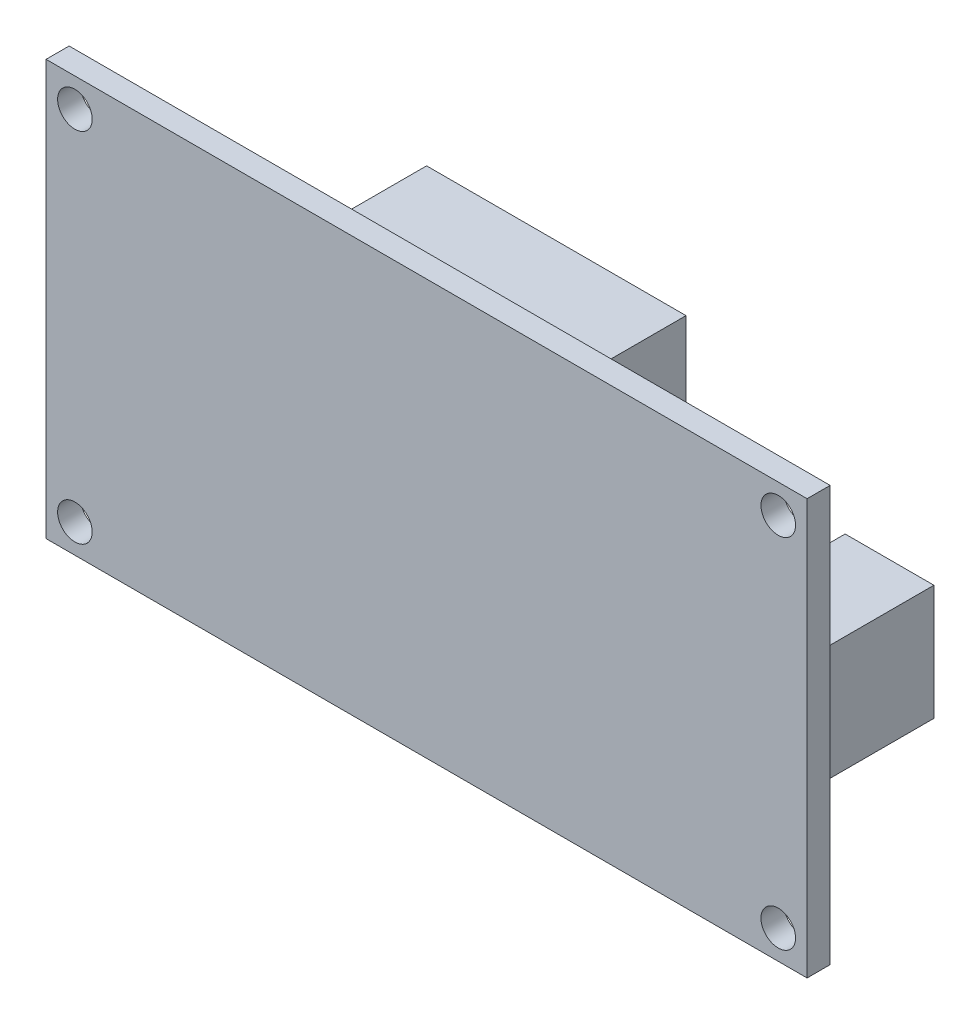
ISO-10303-21;
HEADER;
FILE_DESCRIPTION(('STEP AP214'),'2;1');
FILE_NAME('part.step','',(''),(''),'','','');
FILE_SCHEMA(('AUTOMOTIVE_DESIGN { 1 0 10303 214 1 1 1 1 }'));
ENDSEC;
DATA;
#1=APPLICATION_CONTEXT('core data for automotive mechanical design processes');
#2=APPLICATION_PROTOCOL_DEFINITION('international standard','automotive_design',2000,#1);
#3=PRODUCT_CONTEXT('',#1,'mechanical');
#4=PRODUCT('Part','Part','',(#3));
#5=PRODUCT_RELATED_PRODUCT_CATEGORY('part','',(#4));
#6=PRODUCT_DEFINITION_FORMATION('','',#4);
#7=PRODUCT_DEFINITION_CONTEXT('part definition',#1,'design');
#8=PRODUCT_DEFINITION('design','',#6,#7);
#9=PRODUCT_DEFINITION_SHAPE('','',#8);
#10=(LENGTH_UNIT() NAMED_UNIT(*) SI_UNIT(.MILLI.,.METRE.));
#11=(NAMED_UNIT(*) PLANE_ANGLE_UNIT() SI_UNIT($,.RADIAN.));
#12=(NAMED_UNIT(*) SI_UNIT($,.STERADIAN.) SOLID_ANGLE_UNIT());
#13=UNCERTAINTY_MEASURE_WITH_UNIT(LENGTH_MEASURE(1.E-05),#10,'distance_accuracy_value','');
#14=(GEOMETRIC_REPRESENTATION_CONTEXT(3) GLOBAL_UNCERTAINTY_ASSIGNED_CONTEXT((#13)) GLOBAL_UNIT_ASSIGNED_CONTEXT((#10,
#11,#12)) REPRESENTATION_CONTEXT('',''));
#15=CARTESIAN_POINT('',(0.,0.,0.));
#16=DIRECTION('',(0.,0.,1.));
#17=DIRECTION('',(1.,0.,0.));
#18=AXIS2_PLACEMENT_3D('',#15,#16,#17);
#19=CARTESIAN_POINT('',(0.,0.,0.));
#20=DIRECTION('',(0.,0.,1.));
#21=DIRECTION('',(1.,0.,0.));
#22=AXIS2_PLACEMENT_3D('',#19,#20,#21);
#23=PLANE('',#22);
#24=CARTESIAN_POINT('',(13.,10.,0.));
#25=DIRECTION('',(0.,0.,1.));
#26=DIRECTION('',(1.,0.,0.));
#27=AXIS2_PLACEMENT_3D('',#24,#25,#26);
#28=CIRCLE('',#27,4.);
#29=CARTESIAN_POINT('',(17.,10.,0.));
#30=VERTEX_POINT('',#29);
#31=EDGE_CURVE('E644',#30,#30,#28,.T.);
#32=ORIENTED_EDGE('',*,*,#31,.T.);
#33=EDGE_LOOP('',(#32));
#34=FACE_BOUND('',#33,.T.);
#35=CARTESIAN_POINT('',(50.,10.,0.));
#36=DIRECTION('',(0.,0.,1.));
#37=DIRECTION('',(1.,0.,0.));
#38=AXIS2_PLACEMENT_3D('',#35,#36,#37);
#39=CIRCLE('',#38,4.);
#40=CARTESIAN_POINT('',(54.,10.,0.));
#41=VERTEX_POINT('',#40);
#42=EDGE_CURVE('E180',#41,#41,#39,.T.);
#43=ORIENTED_EDGE('',*,*,#42,.T.);
#44=EDGE_LOOP('',(#43));
#45=FACE_BOUND('',#44,.T.);
#46=DIRECTION('',(0.,1.,0.));
#47=VECTOR('',#46,1.);
#48=CARTESIAN_POINT('',(23.5,0.,0.));
#49=LINE('',#48,#47);
#50=CARTESIAN_POINT('',(23.5,21.,0.));
#51=VERTEX_POINT('',#50);
#52=CARTESIAN_POINT('',(23.5,35.,0.));
#53=VERTEX_POINT('',#52);
#54=EDGE_CURVE('E176',#51,#53,#49,.T.);
#55=ORIENTED_EDGE('',*,*,#54,.F.);
#56=DIRECTION('',(1.,0.,0.));
#57=VECTOR('',#56,1.);
#58=CARTESIAN_POINT('',(0.,21.,0.));
#59=LINE('',#58,#57);
#60=CARTESIAN_POINT('',(46.,21.,0.));
#61=VERTEX_POINT('',#60);
#62=EDGE_CURVE('E185',#51,#61,#59,.T.);
#63=ORIENTED_EDGE('',*,*,#62,.T.);
#64=DIRECTION('',(0.,1.,0.));
#65=VECTOR('',#64,1.);
#66=CARTESIAN_POINT('',(46.,0.,0.));
#67=LINE('',#66,#65);
#68=CARTESIAN_POINT('',(46.,35.,0.));
#69=VERTEX_POINT('',#68);
#70=EDGE_CURVE('E158',#61,#69,#67,.T.);
#71=ORIENTED_EDGE('',*,*,#70,.T.);
#72=DIRECTION('',(1.,0.,0.));
#73=VECTOR('',#72,1.);
#74=CARTESIAN_POINT('',(0.,35.,0.));
#75=LINE('',#74,#73);
#76=EDGE_CURVE('E53',#53,#69,#75,.T.);
#77=ORIENTED_EDGE('',*,*,#76,.F.);
#78=EDGE_LOOP('',(#55,#63,#71,#77));
#79=FACE_BOUND('',#78,.T.);
#80=DIRECTION('',(1.,0.,0.));
#81=VECTOR('',#80,1.);
#82=CARTESIAN_POINT('',(0.,13.,0.));
#83=LINE('',#82,#81);
#84=CARTESIAN_POINT('',(57.3,13.,0.));
#85=VERTEX_POINT('',#84);
#86=CARTESIAN_POINT('',(65.,13.,0.));
#87=VERTEX_POINT('',#86);
#88=EDGE_CURVE('E199',#85,#87,#83,.T.);
#89=ORIENTED_EDGE('',*,*,#88,.T.);
#90=DIRECTION('',(0.,1.,0.));
#91=VECTOR('',#90,1.);
#92=CARTESIAN_POINT('',(65.,0.,0.));
#93=LINE('',#92,#91);
#94=CARTESIAN_POINT('',(65.,23.,0.));
#95=VERTEX_POINT('',#94);
#96=EDGE_CURVE('E191',#87,#95,#93,.T.);
#97=ORIENTED_EDGE('',*,*,#96,.T.);
#98=DIRECTION('',(-1.,0.,0.));
#99=VECTOR('',#98,1.);
#100=CARTESIAN_POINT('',(0.,23.,0.));
#101=LINE('',#100,#99);
#102=CARTESIAN_POINT('',(57.3,23.,0.));
#103=VERTEX_POINT('',#102);
#104=EDGE_CURVE('E211',#95,#103,#101,.T.);
#105=ORIENTED_EDGE('',*,*,#104,.T.);
#106=DIRECTION('',(0.,-1.,0.));
#107=VECTOR('',#106,1.);
#108=CARTESIAN_POINT('',(57.3,0.,0.));
#109=LINE('',#108,#107);
#110=EDGE_CURVE('E61',#103,#85,#109,.T.);
#111=ORIENTED_EDGE('',*,*,#110,.T.);
#112=EDGE_LOOP('',(#89,#97,#105,#111));
#113=FACE_BOUND('',#112,.T.);
#114=CARTESIAN_POINT('',(63.5,2.5,0.));
#115=DIRECTION('',(0.,0.,1.));
#116=DIRECTION('',(1.,0.,0.));
#117=AXIS2_PLACEMENT_3D('',#114,#115,#116);
#118=CIRCLE('',#117,1.5);
#119=CARTESIAN_POINT('',(65.,2.5,0.));
#120=VERTEX_POINT('',#119);
#121=EDGE_CURVE('E262',#120,#120,#118,.F.);
#122=ORIENTED_EDGE('',*,*,#121,.F.);
#123=EDGE_LOOP('',(#122));
#124=FACE_BOUND('',#123,.T.);
#125=CARTESIAN_POINT('',(2.5,2.5,0.));
#126=DIRECTION('',(0.,0.,1.));
#127=DIRECTION('',(1.,0.,0.));
#128=AXIS2_PLACEMENT_3D('',#125,#126,#127);
#129=CIRCLE('',#128,1.5);
#130=CARTESIAN_POINT('',(4.,2.5,0.));
#131=VERTEX_POINT('',#130);
#132=EDGE_CURVE('E300',#131,#131,#129,.T.);
#133=ORIENTED_EDGE('',*,*,#132,.T.);
#134=EDGE_LOOP('',(#133));
#135=FACE_BOUND('',#134,.T.);
#136=DIRECTION('',(1.,0.,0.));
#137=VECTOR('',#136,1.);
#138=CARTESIAN_POINT('',(0.,0.,0.));
#139=LINE('',#138,#137);
#140=CARTESIAN_POINT('',(0.,0.,0.));
#141=VERTEX_POINT('',#140);
#142=CARTESIAN_POINT('',(66.,0.,0.));
#143=VERTEX_POINT('',#142);
#144=EDGE_CURVE('E288',#141,#143,#139,.T.);
#145=ORIENTED_EDGE('',*,*,#144,.F.);
#146=DIRECTION('',(0.,1.,0.));
#147=VECTOR('',#146,1.);
#148=CARTESIAN_POINT('',(0.,0.,0.));
#149=LINE('',#148,#147);
#150=CARTESIAN_POINT('',(0.,36.,0.));
#151=VERTEX_POINT('',#150);
#152=EDGE_CURVE('E297',#141,#151,#149,.T.);
#153=ORIENTED_EDGE('',*,*,#152,.T.);
#154=DIRECTION('',(1.,0.,0.));
#155=VECTOR('',#154,1.);
#156=CARTESIAN_POINT('',(0.,36.,0.));
#157=LINE('',#156,#155);
#158=CARTESIAN_POINT('',(66.,36.,0.));
#159=VERTEX_POINT('',#158);
#160=EDGE_CURVE('E294',#151,#159,#157,.T.);
#161=ORIENTED_EDGE('',*,*,#160,.T.);
#162=DIRECTION('',(0.,1.,0.));
#163=VECTOR('',#162,1.);
#164=CARTESIAN_POINT('',(66.,0.,0.));
#165=LINE('',#164,#163);
#166=EDGE_CURVE('E291',#143,#159,#165,.T.);
#167=ORIENTED_EDGE('',*,*,#166,.F.);
#168=EDGE_LOOP('',(#145,#153,#161,#167));
#169=FACE_BOUND('',#168,.T.);
#170=CARTESIAN_POINT('',(63.5,33.5,0.));
#171=DIRECTION('',(0.,0.,1.));
#172=DIRECTION('',(1.,0.,0.));
#173=AXIS2_PLACEMENT_3D('',#170,#171,#172);
#174=CIRCLE('',#173,1.5);
#175=CARTESIAN_POINT('',(65.,33.5,0.));
#176=VERTEX_POINT('',#175);
#177=EDGE_CURVE('E285',#176,#176,#174,.T.);
#178=ORIENTED_EDGE('',*,*,#177,.T.);
#179=EDGE_LOOP('',(#178));
#180=FACE_BOUND('',#179,.T.);
#181=CARTESIAN_POINT('',(2.5,33.5,0.));
#182=DIRECTION('',(0.,0.,1.));
#183=DIRECTION('',(1.,0.,0.));
#184=AXIS2_PLACEMENT_3D('',#181,#182,#183);
#185=CIRCLE('',#184,1.5);
#186=CARTESIAN_POINT('',(4.,33.5,0.));
#187=VERTEX_POINT('',#186);
#188=EDGE_CURVE('E249',#187,#187,#185,.F.);
#189=ORIENTED_EDGE('',*,*,#188,.F.);
#190=EDGE_LOOP('',(#189));
#191=FACE_BOUND('',#190,.T.);
#192=DIRECTION('',(0.,-1.,0.));
#193=VECTOR('',#192,1.);
#194=CARTESIAN_POINT('',(8.70000000000001,0.,0.));
#195=LINE('',#194,#193);
#196=CARTESIAN_POINT('',(8.70000000000001,23.,0.));
#197=VERTEX_POINT('',#196);
#198=CARTESIAN_POINT('',(8.70000000000001,13.,0.));
#199=VERTEX_POINT('',#198);
#200=EDGE_CURVE('E219',#197,#199,#195,.T.);
#201=ORIENTED_EDGE('',*,*,#200,.F.);
#202=DIRECTION('',(1.,0.,0.));
#203=VECTOR('',#202,1.);
#204=CARTESIAN_POINT('',(0.,23.,0.));
#205=LINE('',#204,#203);
#206=CARTESIAN_POINT('',(1.00000000000001,23.,0.));
#207=VERTEX_POINT('',#206);
#208=EDGE_CURVE('E238',#207,#197,#205,.T.);
#209=ORIENTED_EDGE('',*,*,#208,.F.);
#210=DIRECTION('',(0.,1.,0.));
#211=VECTOR('',#210,1.);
#212=CARTESIAN_POINT('',(1.00000000000001,0.,0.));
#213=LINE('',#212,#211);
#214=CARTESIAN_POINT('',(1.00000000000001,13.,0.));
#215=VERTEX_POINT('',#214);
#216=EDGE_CURVE('E241',#215,#207,#213,.T.);
#217=ORIENTED_EDGE('',*,*,#216,.F.);
#218=DIRECTION('',(-1.,0.,0.));
#219=VECTOR('',#218,1.);
#220=CARTESIAN_POINT('',(0.,13.,0.));
#221=LINE('',#220,#219);
#222=EDGE_CURVE('E229',#199,#215,#221,.T.);
#223=ORIENTED_EDGE('',*,*,#222,.F.);
#224=EDGE_LOOP('',(#201,#209,#217,#223));
#225=FACE_BOUND('',#224,.T.);
#226=ADVANCED_FACE('F38',(#34,#45,#79,#113,#124,#135,#169,#180,#191,#225),#23,.F.);
#227=CARTESIAN_POINT('',(0.,0.,2.));
#228=DIRECTION('',(0.,1.,0.));
#229=DIRECTION('',(0.,0.,1.));
#230=AXIS2_PLACEMENT_3D('',#227,#228,#229);
#231=PLANE('',#230);
#232=ORIENTED_EDGE('',*,*,#144,.T.);
#233=DIRECTION('',(0.,0.,-1.));
#234=VECTOR('',#233,1.);
#235=CARTESIAN_POINT('',(66.,0.,2.));
#236=LINE('',#235,#234);
#237=CARTESIAN_POINT('',(66.,0.,2.));
#238=VERTEX_POINT('',#237);
#239=EDGE_CURVE('E11',#238,#143,#236,.T.);
#240=ORIENTED_EDGE('',*,*,#239,.F.);
#241=DIRECTION('',(1.,0.,0.));
#242=VECTOR('',#241,1.);
#243=CARTESIAN_POINT('',(0.,0.,2.));
#244=LINE('',#243,#242);
#245=CARTESIAN_POINT('',(0.,0.,2.));
#246=VERTEX_POINT('',#245);
#247=EDGE_CURVE('E265',#246,#238,#244,.T.);
#248=ORIENTED_EDGE('',*,*,#247,.F.);
#249=DIRECTION('',(0.,0.,-1.));
#250=VECTOR('',#249,1.);
#251=CARTESIAN_POINT('',(0.,0.,2.));
#252=LINE('',#251,#250);
#253=EDGE_CURVE('E282',#246,#141,#252,.T.);
#254=ORIENTED_EDGE('',*,*,#253,.T.);
#255=EDGE_LOOP('',(#232,#240,#248,#254));
#256=FACE_BOUND('',#255,.T.);
#257=ADVANCED_FACE('F327',(#256),#231,.F.);
#258=CARTESIAN_POINT('',(66.,0.,2.));
#259=DIRECTION('',(-1.,0.,0.));
#260=DIRECTION('',(0.,0.,1.));
#261=AXIS2_PLACEMENT_3D('',#258,#259,#260);
#262=PLANE('',#261);
#263=ORIENTED_EDGE('',*,*,#166,.T.);
#264=DIRECTION('',(0.,0.,-1.));
#265=VECTOR('',#264,1.);
#266=CARTESIAN_POINT('',(66.,36.,2.));
#267=LINE('',#266,#265);
#268=CARTESIAN_POINT('',(66.,36.,2.));
#269=VERTEX_POINT('',#268);
#270=EDGE_CURVE('E46',#269,#159,#267,.T.);
#271=ORIENTED_EDGE('',*,*,#270,.F.);
#272=DIRECTION('',(0.,1.,0.));
#273=VECTOR('',#272,1.);
#274=CARTESIAN_POINT('',(66.,0.,2.));
#275=LINE('',#274,#273);
#276=EDGE_CURVE('E268',#238,#269,#275,.T.);
#277=ORIENTED_EDGE('',*,*,#276,.F.);
#278=ORIENTED_EDGE('',*,*,#239,.T.);
#279=EDGE_LOOP('',(#263,#271,#277,#278));
#280=FACE_BOUND('',#279,.T.);
#281=ADVANCED_FACE('F313',(#280),#262,.F.);
#282=CARTESIAN_POINT('',(0.,36.,2.));
#283=DIRECTION('',(0.,1.,0.));
#284=DIRECTION('',(0.,0.,1.));
#285=AXIS2_PLACEMENT_3D('',#282,#283,#284);
#286=PLANE('',#285);
#287=ORIENTED_EDGE('',*,*,#160,.F.);
#288=DIRECTION('',(0.,0.,-1.));
#289=VECTOR('',#288,1.);
#290=CARTESIAN_POINT('',(0.,36.,2.));
#291=LINE('',#290,#289);
#292=CARTESIAN_POINT('',(0.,36.,2.));
#293=VERTEX_POINT('',#292);
#294=EDGE_CURVE('E306',#293,#151,#291,.T.);
#295=ORIENTED_EDGE('',*,*,#294,.F.);
#296=DIRECTION('',(1.,0.,0.));
#297=VECTOR('',#296,1.);
#298=CARTESIAN_POINT('',(0.,36.,2.));
#299=LINE('',#298,#297);
#300=EDGE_CURVE('E270',#293,#269,#299,.T.);
#301=ORIENTED_EDGE('',*,*,#300,.T.);
#302=ORIENTED_EDGE('',*,*,#270,.T.);
#303=EDGE_LOOP('',(#287,#295,#301,#302));
#304=FACE_BOUND('',#303,.T.);
#305=ADVANCED_FACE('F310',(#304),#286,.T.);
#306=CARTESIAN_POINT('',(2.5,2.5,2.));
#307=DIRECTION('',(0.,0.,-1.));
#308=DIRECTION('',(-1.,0.,0.));
#309=AXIS2_PLACEMENT_3D('',#306,#307,#308);
#310=CYLINDRICAL_SURFACE('',#309,1.5);
#311=CARTESIAN_POINT('',(2.5,2.5,2.));
#312=DIRECTION('',(0.,0.,1.));
#313=DIRECTION('',(1.,0.,0.));
#314=AXIS2_PLACEMENT_3D('',#311,#312,#313);
#315=CIRCLE('',#314,1.5);
#316=CARTESIAN_POINT('',(4.,2.5,2.));
#317=VERTEX_POINT('',#316);
#318=EDGE_CURVE('E276',#317,#317,#315,.T.);
#319=ORIENTED_EDGE('',*,*,#318,.T.);
#320=EDGE_LOOP('',(#319));
#321=FACE_BOUND('',#320,.T.);
#322=ORIENTED_EDGE('',*,*,#132,.F.);
#323=EDGE_LOOP('',(#322));
#324=FACE_BOUND('',#323,.T.);
#325=ADVANCED_FACE('F347',(#321,#324),#310,.F.);
#326=CARTESIAN_POINT('',(0.,0.,2.));
#327=DIRECTION('',(-1.,0.,0.));
#328=DIRECTION('',(0.,0.,1.));
#329=AXIS2_PLACEMENT_3D('',#326,#327,#328);
#330=PLANE('',#329);
#331=ORIENTED_EDGE('',*,*,#152,.F.);
#332=ORIENTED_EDGE('',*,*,#253,.F.);
#333=DIRECTION('',(0.,1.,0.));
#334=VECTOR('',#333,1.);
#335=CARTESIAN_POINT('',(0.,0.,2.));
#336=LINE('',#335,#334);
#337=EDGE_CURVE('E273',#246,#293,#336,.T.);
#338=ORIENTED_EDGE('',*,*,#337,.T.);
#339=ORIENTED_EDGE('',*,*,#294,.T.);
#340=EDGE_LOOP('',(#331,#332,#338,#339));
#341=FACE_BOUND('',#340,.T.);
#342=ADVANCED_FACE('F320',(#341),#330,.T.);
#343=CARTESIAN_POINT('',(63.5,33.5,2.));
#344=DIRECTION('',(0.,0.,-1.));
#345=DIRECTION('',(-1.,0.,0.));
#346=AXIS2_PLACEMENT_3D('',#343,#344,#345);
#347=CYLINDRICAL_SURFACE('',#346,1.5);
#348=CARTESIAN_POINT('',(63.5,33.5,2.));
#349=DIRECTION('',(0.,0.,1.));
#350=DIRECTION('',(1.,0.,0.));
#351=AXIS2_PLACEMENT_3D('',#348,#349,#350);
#352=CIRCLE('',#351,1.5);
#353=CARTESIAN_POINT('',(65.,33.5,2.));
#354=VERTEX_POINT('',#353);
#355=EDGE_CURVE('E261',#354,#354,#352,.T.);
#356=ORIENTED_EDGE('',*,*,#355,.T.);
#357=EDGE_LOOP('',(#356));
#358=FACE_BOUND('',#357,.T.);
#359=ORIENTED_EDGE('',*,*,#177,.F.);
#360=EDGE_LOOP('',(#359));
#361=FACE_BOUND('',#360,.T.);
#362=ADVANCED_FACE('F338',(#358,#361),#347,.F.);
#363=CARTESIAN_POINT('',(2.5,33.5,2.));
#364=DIRECTION('',(0.,0.,-1.));
#365=DIRECTION('',(-1.,0.,0.));
#366=AXIS2_PLACEMENT_3D('',#363,#364,#365);
#367=CYLINDRICAL_SURFACE('',#366,1.5);
#368=CARTESIAN_POINT('',(2.5,33.5,2.));
#369=DIRECTION('',(0.,0.,1.));
#370=DIRECTION('',(1.,0.,0.));
#371=AXIS2_PLACEMENT_3D('',#368,#369,#370);
#372=CIRCLE('',#371,1.5);
#373=CARTESIAN_POINT('',(4.,33.5,2.));
#374=VERTEX_POINT('',#373);
#375=EDGE_CURVE('E258',#374,#374,#372,.F.);
#376=ORIENTED_EDGE('',*,*,#375,.F.);
#377=EDGE_LOOP('',(#376));
#378=FACE_BOUND('',#377,.T.);
#379=ORIENTED_EDGE('',*,*,#188,.T.);
#380=EDGE_LOOP('',(#379));
#381=FACE_BOUND('',#380,.T.);
#382=ADVANCED_FACE('F40',(#378,#381),#367,.F.);
#383=CARTESIAN_POINT('',(63.5,2.5,2.));
#384=DIRECTION('',(0.,0.,-1.));
#385=DIRECTION('',(-1.,0.,0.));
#386=AXIS2_PLACEMENT_3D('',#383,#384,#385);
#387=CYLINDRICAL_SURFACE('',#386,1.5);
#388=CARTESIAN_POINT('',(63.5,2.5,2.));
#389=DIRECTION('',(0.,0.,1.));
#390=DIRECTION('',(1.,0.,0.));
#391=AXIS2_PLACEMENT_3D('',#388,#389,#390);
#392=CIRCLE('',#391,1.5);
#393=CARTESIAN_POINT('',(65.,2.5,2.));
#394=VERTEX_POINT('',#393);
#395=EDGE_CURVE('E279',#394,#394,#392,.F.);
#396=ORIENTED_EDGE('',*,*,#395,.F.);
#397=EDGE_LOOP('',(#396));
#398=FACE_BOUND('',#397,.T.);
#399=ORIENTED_EDGE('',*,*,#121,.T.);
#400=EDGE_LOOP('',(#399));
#401=FACE_BOUND('',#400,.T.);
#402=ADVANCED_FACE('F345',(#398,#401),#387,.F.);
#403=CARTESIAN_POINT('',(0.,0.,2.));
#404=DIRECTION('',(0.,0.,1.));
#405=DIRECTION('',(1.,0.,0.));
#406=AXIS2_PLACEMENT_3D('',#403,#404,#405);
#407=PLANE('',#406);
#408=ORIENTED_EDGE('',*,*,#375,.T.);
#409=EDGE_LOOP('',(#408));
#410=FACE_BOUND('',#409,.T.);
#411=ORIENTED_EDGE('',*,*,#355,.F.);
#412=EDGE_LOOP('',(#411));
#413=FACE_BOUND('',#412,.T.);
#414=ORIENTED_EDGE('',*,*,#247,.T.);
#415=ORIENTED_EDGE('',*,*,#276,.T.);
#416=ORIENTED_EDGE('',*,*,#300,.F.);
#417=ORIENTED_EDGE('',*,*,#337,.F.);
#418=EDGE_LOOP('',(#414,#415,#416,#417));
#419=FACE_BOUND('',#418,.T.);
#420=ORIENTED_EDGE('',*,*,#318,.F.);
#421=EDGE_LOOP('',(#420));
#422=FACE_BOUND('',#421,.T.);
#423=ORIENTED_EDGE('',*,*,#395,.T.);
#424=EDGE_LOOP('',(#423));
#425=FACE_BOUND('',#424,.T.);
#426=ADVANCED_FACE('F324',(#410,#413,#419,#422,#425),#407,.T.);
#427=CARTESIAN_POINT('',(8.70000000000001,0.,-10.));
#428=DIRECTION('',(-1.,0.,0.));
#429=DIRECTION('',(0.,0.,1.));
#430=AXIS2_PLACEMENT_3D('',#427,#428,#429);
#431=PLANE('',#430);
#432=ORIENTED_EDGE('',*,*,#200,.T.);
#433=DIRECTION('',(0.,0.,1.));
#434=VECTOR('',#433,1.);
#435=CARTESIAN_POINT('',(8.70000000000001,13.,-10.));
#436=LINE('',#435,#434);
#437=CARTESIAN_POINT('',(8.70000000000001,13.,-10.));
#438=VERTEX_POINT('',#437);
#439=EDGE_CURVE('E246',#438,#199,#436,.T.);
#440=ORIENTED_EDGE('',*,*,#439,.F.);
#441=DIRECTION('',(0.,-1.,0.));
#442=VECTOR('',#441,1.);
#443=CARTESIAN_POINT('',(8.70000000000001,0.,-10.));
#444=LINE('',#443,#442);
#445=CARTESIAN_POINT('',(8.70000000000001,23.,-10.));
#446=VERTEX_POINT('',#445);
#447=EDGE_CURVE('E225',#446,#438,#444,.T.);
#448=ORIENTED_EDGE('',*,*,#447,.F.);
#449=DIRECTION('',(0.,0.,1.));
#450=VECTOR('',#449,1.);
#451=CARTESIAN_POINT('',(8.70000000000001,23.,-10.));
#452=LINE('',#451,#450);
#453=EDGE_CURVE('E235',#446,#197,#452,.T.);
#454=ORIENTED_EDGE('',*,*,#453,.T.);
#455=EDGE_LOOP('',(#432,#440,#448,#454));
#456=FACE_BOUND('',#455,.T.);
#457=ADVANCED_FACE('F363',(#456),#431,.F.);
#458=CARTESIAN_POINT('',(0.,13.,-10.));
#459=DIRECTION('',(0.,1.,0.));
#460=DIRECTION('',(0.,0.,1.));
#461=AXIS2_PLACEMENT_3D('',#458,#459,#460);
#462=PLANE('',#461);
#463=ORIENTED_EDGE('',*,*,#222,.T.);
#464=DIRECTION('',(0.,0.,1.));
#465=VECTOR('',#464,1.);
#466=CARTESIAN_POINT('',(1.00000000000001,13.,-10.));
#467=LINE('',#466,#465);
#468=CARTESIAN_POINT('',(1.00000000000001,13.,-10.));
#469=VERTEX_POINT('',#468);
#470=EDGE_CURVE('E250',#469,#215,#467,.T.);
#471=ORIENTED_EDGE('',*,*,#470,.F.);
#472=DIRECTION('',(-1.,0.,0.));
#473=VECTOR('',#472,1.);
#474=CARTESIAN_POINT('',(0.,13.,-10.));
#475=LINE('',#474,#473);
#476=EDGE_CURVE('E233',#438,#469,#475,.T.);
#477=ORIENTED_EDGE('',*,*,#476,.F.);
#478=ORIENTED_EDGE('',*,*,#439,.T.);
#479=EDGE_LOOP('',(#463,#471,#477,#478));
#480=FACE_BOUND('',#479,.T.);
#481=ADVANCED_FACE('F371',(#480),#462,.F.);
#482=CARTESIAN_POINT('',(1.00000000000001,0.,-10.));
#483=DIRECTION('',(1.,0.,0.));
#484=DIRECTION('',(0.,0.,-1.));
#485=AXIS2_PLACEMENT_3D('',#482,#483,#484);
#486=PLANE('',#485);
#487=ORIENTED_EDGE('',*,*,#216,.T.);
#488=DIRECTION('',(0.,0.,1.));
#489=VECTOR('',#488,1.);
#490=CARTESIAN_POINT('',(1.00000000000001,23.,-10.));
#491=LINE('',#490,#489);
#492=CARTESIAN_POINT('',(1.00000000000001,23.,-10.));
#493=VERTEX_POINT('',#492);
#494=EDGE_CURVE('E253',#493,#207,#491,.T.);
#495=ORIENTED_EDGE('',*,*,#494,.F.);
#496=DIRECTION('',(0.,1.,0.));
#497=VECTOR('',#496,1.);
#498=CARTESIAN_POINT('',(1.00000000000001,0.,-10.));
#499=LINE('',#498,#497);
#500=EDGE_CURVE('E231',#469,#493,#499,.T.);
#501=ORIENTED_EDGE('',*,*,#500,.F.);
#502=ORIENTED_EDGE('',*,*,#470,.T.);
#503=EDGE_LOOP('',(#487,#495,#501,#502));
#504=FACE_BOUND('',#503,.T.);
#505=ADVANCED_FACE('F369',(#504),#486,.F.);
#506=CARTESIAN_POINT('',(0.,23.,-10.));
#507=DIRECTION('',(0.,-1.,0.));
#508=DIRECTION('',(0.,0.,-1.));
#509=AXIS2_PLACEMENT_3D('',#506,#507,#508);
#510=PLANE('',#509);
#511=ORIENTED_EDGE('',*,*,#208,.T.);
#512=ORIENTED_EDGE('',*,*,#453,.F.);
#513=DIRECTION('',(1.,0.,0.));
#514=VECTOR('',#513,1.);
#515=CARTESIAN_POINT('',(0.,23.,-10.));
#516=LINE('',#515,#514);
#517=EDGE_CURVE('E228',#493,#446,#516,.T.);
#518=ORIENTED_EDGE('',*,*,#517,.F.);
#519=ORIENTED_EDGE('',*,*,#494,.T.);
#520=EDGE_LOOP('',(#511,#512,#518,#519));
#521=FACE_BOUND('',#520,.T.);
#522=ADVANCED_FACE('F359',(#521),#510,.F.);
#523=CARTESIAN_POINT('',(0.,0.,-10.));
#524=DIRECTION('',(0.,0.,1.));
#525=DIRECTION('',(1.,0.,0.));
#526=AXIS2_PLACEMENT_3D('',#523,#524,#525);
#527=PLANE('',#526);
#528=ORIENTED_EDGE('',*,*,#447,.T.);
#529=ORIENTED_EDGE('',*,*,#476,.T.);
#530=ORIENTED_EDGE('',*,*,#500,.T.);
#531=ORIENTED_EDGE('',*,*,#517,.T.);
#532=EDGE_LOOP('',(#528,#529,#530,#531));
#533=FACE_BOUND('',#532,.T.);
#534=ADVANCED_FACE('F365',(#533),#527,.F.);
#535=CARTESIAN_POINT('',(65.,0.,-10.));
#536=DIRECTION('',(1.,0.,0.));
#537=DIRECTION('',(0.,0.,-1.));
#538=AXIS2_PLACEMENT_3D('',#535,#536,#537);
#539=PLANE('',#538);
#540=ORIENTED_EDGE('',*,*,#96,.F.);
#541=DIRECTION('',(0.,0.,1.));
#542=VECTOR('',#541,1.);
#543=CARTESIAN_POINT('',(65.,13.,-10.));
#544=LINE('',#543,#542);
#545=CARTESIAN_POINT('',(65.,13.,-10.));
#546=VERTEX_POINT('',#545);
#547=EDGE_CURVE('E217',#546,#87,#544,.T.);
#548=ORIENTED_EDGE('',*,*,#547,.F.);
#549=DIRECTION('',(0.,1.,0.));
#550=VECTOR('',#549,1.);
#551=CARTESIAN_POINT('',(65.,0.,-10.));
#552=LINE('',#551,#550);
#553=CARTESIAN_POINT('',(65.,23.,-10.));
#554=VERTEX_POINT('',#553);
#555=EDGE_CURVE('E195',#546,#554,#552,.T.);
#556=ORIENTED_EDGE('',*,*,#555,.T.);
#557=DIRECTION('',(0.,0.,1.));
#558=VECTOR('',#557,1.);
#559=CARTESIAN_POINT('',(65.,23.,-10.));
#560=LINE('',#559,#558);
#561=EDGE_CURVE('E208',#554,#95,#560,.T.);
#562=ORIENTED_EDGE('',*,*,#561,.T.);
#563=EDGE_LOOP('',(#540,#548,#556,#562));
#564=FACE_BOUND('',#563,.T.);
#565=ADVANCED_FACE('F469',(#564),#539,.T.);
#566=CARTESIAN_POINT('',(0.,13.,-10.));
#567=DIRECTION('',(0.,-1.,0.));
#568=DIRECTION('',(0.,0.,-1.));
#569=AXIS2_PLACEMENT_3D('',#566,#567,#568);
#570=PLANE('',#569);
#571=ORIENTED_EDGE('',*,*,#88,.F.);
#572=DIRECTION('',(0.,0.,1.));
#573=VECTOR('',#572,1.);
#574=CARTESIAN_POINT('',(57.3,13.,-10.));
#575=LINE('',#574,#573);
#576=CARTESIAN_POINT('',(57.3,13.,-10.));
#577=VERTEX_POINT('',#576);
#578=EDGE_CURVE('E220',#577,#85,#575,.T.);
#579=ORIENTED_EDGE('',*,*,#578,.F.);
#580=DIRECTION('',(1.,0.,0.));
#581=VECTOR('',#580,1.);
#582=CARTESIAN_POINT('',(0.,13.,-10.));
#583=LINE('',#582,#581);
#584=EDGE_CURVE('E205',#577,#546,#583,.T.);
#585=ORIENTED_EDGE('',*,*,#584,.T.);
#586=ORIENTED_EDGE('',*,*,#547,.T.);
#587=EDGE_LOOP('',(#571,#579,#585,#586));
#588=FACE_BOUND('',#587,.T.);
#589=ADVANCED_FACE('F478',(#588),#570,.T.);
#590=CARTESIAN_POINT('',(57.3,0.,-10.));
#591=DIRECTION('',(-1.,0.,0.));
#592=DIRECTION('',(0.,0.,1.));
#593=AXIS2_PLACEMENT_3D('',#590,#591,#592);
#594=PLANE('',#593);
#595=ORIENTED_EDGE('',*,*,#110,.F.);
#596=DIRECTION('',(0.,0.,1.));
#597=VECTOR('',#596,1.);
#598=CARTESIAN_POINT('',(57.3,23.,-10.));
#599=LINE('',#598,#597);
#600=CARTESIAN_POINT('',(57.3,23.,-10.));
#601=VERTEX_POINT('',#600);
#602=EDGE_CURVE('E222',#601,#103,#599,.T.);
#603=ORIENTED_EDGE('',*,*,#602,.F.);
#604=DIRECTION('',(0.,-1.,0.));
#605=VECTOR('',#604,1.);
#606=CARTESIAN_POINT('',(57.3,0.,-10.));
#607=LINE('',#606,#605);
#608=EDGE_CURVE('E202',#601,#577,#607,.T.);
#609=ORIENTED_EDGE('',*,*,#608,.T.);
#610=ORIENTED_EDGE('',*,*,#578,.T.);
#611=EDGE_LOOP('',(#595,#603,#609,#610));
#612=FACE_BOUND('',#611,.T.);
#613=ADVANCED_FACE('F488',(#612),#594,.T.);
#614=CARTESIAN_POINT('',(0.,23.,-10.));
#615=DIRECTION('',(0.,1.,0.));
#616=DIRECTION('',(0.,0.,1.));
#617=AXIS2_PLACEMENT_3D('',#614,#615,#616);
#618=PLANE('',#617);
#619=ORIENTED_EDGE('',*,*,#104,.F.);
#620=ORIENTED_EDGE('',*,*,#561,.F.);
#621=DIRECTION('',(-1.,0.,0.));
#622=VECTOR('',#621,1.);
#623=CARTESIAN_POINT('',(0.,23.,-10.));
#624=LINE('',#623,#622);
#625=EDGE_CURVE('E198',#554,#601,#624,.T.);
#626=ORIENTED_EDGE('',*,*,#625,.T.);
#627=ORIENTED_EDGE('',*,*,#602,.T.);
#628=EDGE_LOOP('',(#619,#620,#626,#627));
#629=FACE_BOUND('',#628,.T.);
#630=ADVANCED_FACE('F499',(#629),#618,.T.);
#631=CARTESIAN_POINT('',(0.,0.,-10.));
#632=DIRECTION('',(0.,0.,1.));
#633=DIRECTION('',(1.,0.,0.));
#634=AXIS2_PLACEMENT_3D('',#631,#632,#633);
#635=PLANE('',#634);
#636=ORIENTED_EDGE('',*,*,#555,.F.);
#637=ORIENTED_EDGE('',*,*,#584,.F.);
#638=ORIENTED_EDGE('',*,*,#608,.F.);
#639=ORIENTED_EDGE('',*,*,#625,.F.);
#640=EDGE_LOOP('',(#636,#637,#638,#639));
#641=FACE_BOUND('',#640,.T.);
#642=ADVANCED_FACE('F509',(#641),#635,.F.);
#643=CARTESIAN_POINT('',(0.,21.,-7.5));
#644=DIRECTION('',(0.,-1.,0.));
#645=DIRECTION('',(0.,0.,-1.));
#646=AXIS2_PLACEMENT_3D('',#643,#644,#645);
#647=PLANE('',#646);
#648=ORIENTED_EDGE('',*,*,#62,.F.);
#649=DIRECTION('',(0.,0.,1.));
#650=VECTOR('',#649,1.);
#651=CARTESIAN_POINT('',(23.5,21.,-7.5));
#652=LINE('',#651,#650);
#653=CARTESIAN_POINT('',(23.5,21.,-7.5));
#654=VERTEX_POINT('',#653);
#655=EDGE_CURVE('E174',#654,#51,#652,.T.);
#656=ORIENTED_EDGE('',*,*,#655,.F.);
#657=DIRECTION('',(1.,0.,0.));
#658=VECTOR('',#657,1.);
#659=CARTESIAN_POINT('',(0.,21.,-7.5));
#660=LINE('',#659,#658);
#661=CARTESIAN_POINT('',(46.,21.,-7.5));
#662=VERTEX_POINT('',#661);
#663=EDGE_CURVE('E169',#654,#662,#660,.T.);
#664=ORIENTED_EDGE('',*,*,#663,.T.);
#665=DIRECTION('',(0.,0.,1.));
#666=VECTOR('',#665,1.);
#667=CARTESIAN_POINT('',(46.,21.,-7.5));
#668=LINE('',#667,#666);
#669=EDGE_CURVE('E153',#662,#61,#668,.T.);
#670=ORIENTED_EDGE('',*,*,#669,.T.);
#671=EDGE_LOOP('',(#648,#656,#664,#670));
#672=FACE_BOUND('',#671,.T.);
#673=ADVANCED_FACE('F173',(#672),#647,.T.);
#674=CARTESIAN_POINT('',(23.5,0.,-7.5));
#675=DIRECTION('',(1.,0.,0.));
#676=DIRECTION('',(0.,1.,0.));
#677=AXIS2_PLACEMENT_3D('',#674,#675,#676);
#678=PLANE('',#677);
#679=ORIENTED_EDGE('',*,*,#54,.T.);
#680=DIRECTION('',(0.,0.,1.));
#681=VECTOR('',#680,1.);
#682=CARTESIAN_POINT('',(23.5,35.,-7.5));
#683=LINE('',#682,#681);
#684=CARTESIAN_POINT('',(23.5,35.,-7.5));
#685=VERTEX_POINT('',#684);
#686=EDGE_CURVE('E192',#685,#53,#683,.T.);
#687=ORIENTED_EDGE('',*,*,#686,.F.);
#688=DIRECTION('',(0.,1.,0.));
#689=VECTOR('',#688,1.);
#690=CARTESIAN_POINT('',(23.5,0.,-7.5));
#691=LINE('',#690,#689);
#692=EDGE_CURVE('E164',#654,#685,#691,.T.);
#693=ORIENTED_EDGE('',*,*,#692,.F.);
#694=ORIENTED_EDGE('',*,*,#655,.T.);
#695=EDGE_LOOP('',(#679,#687,#693,#694));
#696=FACE_BOUND('',#695,.T.);
#697=ADVANCED_FACE('F530',(#696),#678,.F.);
#698=CARTESIAN_POINT('',(0.,35.,-7.5));
#699=DIRECTION('',(0.,-1.,0.));
#700=DIRECTION('',(0.,0.,-1.));
#701=AXIS2_PLACEMENT_3D('',#698,#699,#700);
#702=PLANE('',#701);
#703=ORIENTED_EDGE('',*,*,#76,.T.);
#704=DIRECTION('',(0.,0.,1.));
#705=VECTOR('',#704,1.);
#706=CARTESIAN_POINT('',(46.,35.,-7.5));
#707=LINE('',#706,#705);
#708=CARTESIAN_POINT('',(46.,35.,-7.5));
#709=VERTEX_POINT('',#708);
#710=EDGE_CURVE('E163',#709,#69,#707,.T.);
#711=ORIENTED_EDGE('',*,*,#710,.F.);
#712=DIRECTION('',(1.,0.,0.));
#713=VECTOR('',#712,1.);
#714=CARTESIAN_POINT('',(0.,35.,-7.5));
#715=LINE('',#714,#713);
#716=EDGE_CURVE('E171',#685,#709,#715,.T.);
#717=ORIENTED_EDGE('',*,*,#716,.F.);
#718=ORIENTED_EDGE('',*,*,#686,.T.);
#719=EDGE_LOOP('',(#703,#711,#717,#718));
#720=FACE_BOUND('',#719,.T.);
#721=ADVANCED_FACE('F540',(#720),#702,.F.);
#722=CARTESIAN_POINT('',(46.,0.,-7.5));
#723=DIRECTION('',(1.,0.,0.));
#724=DIRECTION('',(0.,0.,-1.));
#725=AXIS2_PLACEMENT_3D('',#722,#723,#724);
#726=PLANE('',#725);
#727=ORIENTED_EDGE('',*,*,#70,.F.);
#728=ORIENTED_EDGE('',*,*,#669,.F.);
#729=DIRECTION('',(0.,1.,0.));
#730=VECTOR('',#729,1.);
#731=CARTESIAN_POINT('',(46.,0.,-7.5));
#732=LINE('',#731,#730);
#733=EDGE_CURVE('E156',#662,#709,#732,.T.);
#734=ORIENTED_EDGE('',*,*,#733,.T.);
#735=ORIENTED_EDGE('',*,*,#710,.T.);
#736=EDGE_LOOP('',(#727,#728,#734,#735));
#737=FACE_BOUND('',#736,.T.);
#738=ADVANCED_FACE('F155',(#737),#726,.T.);
#739=CARTESIAN_POINT('',(0.,0.,-7.5));
#740=DIRECTION('',(0.,0.,1.));
#741=DIRECTION('',(1.,0.,0.));
#742=AXIS2_PLACEMENT_3D('',#739,#740,#741);
#743=PLANE('',#742);
#744=ORIENTED_EDGE('',*,*,#663,.F.);
#745=ORIENTED_EDGE('',*,*,#692,.T.);
#746=ORIENTED_EDGE('',*,*,#716,.T.);
#747=ORIENTED_EDGE('',*,*,#733,.F.);
#748=EDGE_LOOP('',(#744,#745,#746,#747));
#749=FACE_BOUND('',#748,.T.);
#750=ADVANCED_FACE('F168',(#749),#743,.F.);
#751=CARTESIAN_POINT('',(50.,10.,-10.));
#752=DIRECTION('',(0.,0.,1.));
#753=DIRECTION('',(1.,0.,0.));
#754=AXIS2_PLACEMENT_3D('',#751,#752,#753);
#755=CYLINDRICAL_SURFACE('',#754,4.);
#756=CARTESIAN_POINT('',(50.,10.,-10.));
#757=DIRECTION('',(0.,0.,1.));
#758=DIRECTION('',(1.,0.,0.));
#759=AXIS2_PLACEMENT_3D('',#756,#757,#758);
#760=CIRCLE('',#759,4.);
#761=CARTESIAN_POINT('',(54.,10.,-10.));
#762=VERTEX_POINT('',#761);
#763=EDGE_CURVE('E187',#762,#762,#760,.T.);
#764=ORIENTED_EDGE('',*,*,#763,.T.);
#765=EDGE_LOOP('',(#764));
#766=FACE_BOUND('',#765,.T.);
#767=ORIENTED_EDGE('',*,*,#42,.F.);
#768=EDGE_LOOP('',(#767));
#769=FACE_BOUND('',#768,.T.);
#770=ADVANCED_FACE('F569',(#766,#769),#755,.T.);
#771=CARTESIAN_POINT('',(0.,0.,-10.));
#772=DIRECTION('',(0.,0.,1.));
#773=DIRECTION('',(1.,0.,0.));
#774=AXIS2_PLACEMENT_3D('',#771,#772,#773);
#775=PLANE('',#774);
#776=ORIENTED_EDGE('',*,*,#763,.F.);
#777=EDGE_LOOP('',(#776));
#778=FACE_BOUND('',#777,.T.);
#779=ADVANCED_FACE('F584',(#778),#775,.F.);
#780=CARTESIAN_POINT('',(13.,10.,-10.));
#781=DIRECTION('',(0.,0.,1.));
#782=DIRECTION('',(1.,0.,0.));
#783=AXIS2_PLACEMENT_3D('',#780,#781,#782);
#784=CYLINDRICAL_SURFACE('',#783,4.);
#785=CARTESIAN_POINT('',(13.,10.,-10.));
#786=DIRECTION('',(0.,0.,1.));
#787=DIRECTION('',(1.,0.,0.));
#788=AXIS2_PLACEMENT_3D('',#785,#786,#787);
#789=CIRCLE('',#788,4.);
#790=CARTESIAN_POINT('',(17.,10.,-10.));
#791=VERTEX_POINT('',#790);
#792=EDGE_CURVE('E643',#791,#791,#789,.T.);
#793=ORIENTED_EDGE('',*,*,#792,.T.);
#794=EDGE_LOOP('',(#793));
#795=FACE_BOUND('',#794,.T.);
#796=ORIENTED_EDGE('',*,*,#31,.F.);
#797=EDGE_LOOP('',(#796));
#798=FACE_BOUND('',#797,.T.);
#799=ADVANCED_FACE('F595',(#795,#798),#784,.T.);
#800=CARTESIAN_POINT('',(0.,0.,-10.));
#801=DIRECTION('',(0.,0.,1.));
#802=DIRECTION('',(1.,0.,0.));
#803=AXIS2_PLACEMENT_3D('',#800,#801,#802);
#804=PLANE('',#803);
#805=ORIENTED_EDGE('',*,*,#792,.F.);
#806=EDGE_LOOP('',(#805));
#807=FACE_BOUND('',#806,.T.);
#808=ADVANCED_FACE('F606',(#807),#804,.F.);
#809=CLOSED_SHELL('',(#226,#257,#281,#305,#325,#342,#362,#382,#402,#426,#457,#481,#505,#522,
#534,#565,#589,#613,#630,#642,#673,#697,#721,#738,#750,#770,#779,#799,#808));
#810=MANIFOLD_SOLID_BREP('B2',#809);
#811=ADVANCED_BREP_SHAPE_REPRESENTATION('',(#18,#810),#14);
#812=SHAPE_DEFINITION_REPRESENTATION(#9,#811);
ENDSEC;
END-ISO-10303-21;
